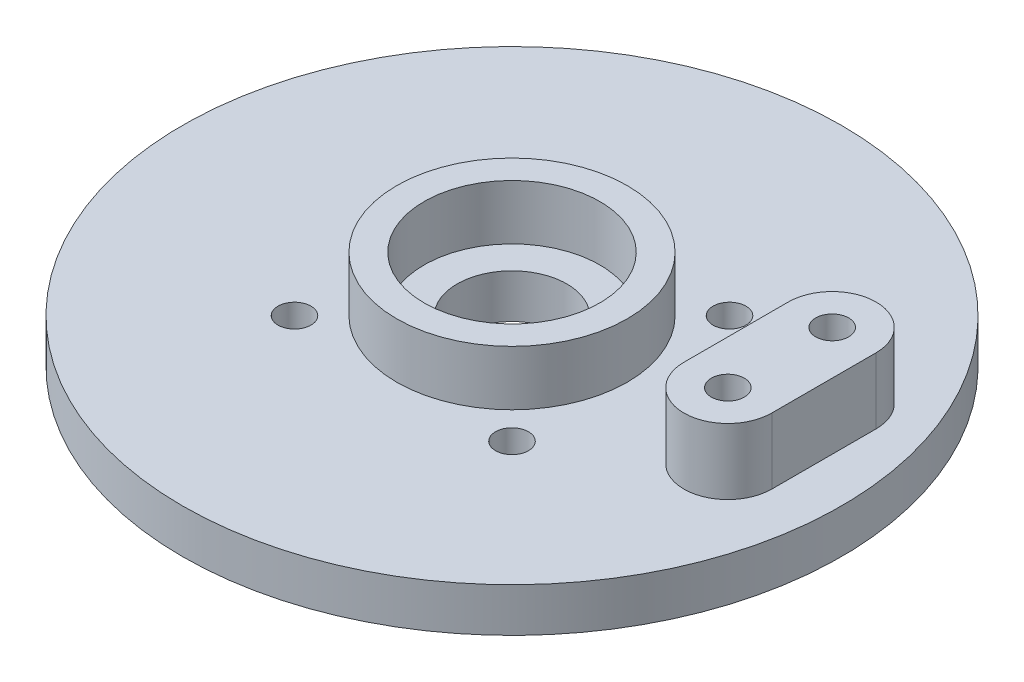
ISO-10303-21;
HEADER;
FILE_DESCRIPTION(('STEP AP214'),'2;1');
FILE_NAME('part.step','',(''),(''),'','','');
FILE_SCHEMA(('AUTOMOTIVE_DESIGN { 1 0 10303 214 1 1 1 1 }'));
ENDSEC;
DATA;
#1=APPLICATION_CONTEXT('core data for automotive mechanical design processes');
#2=APPLICATION_PROTOCOL_DEFINITION('international standard','automotive_design',2000,#1);
#3=PRODUCT_CONTEXT('',#1,'mechanical');
#4=PRODUCT('Part','Part','',(#3));
#5=PRODUCT_RELATED_PRODUCT_CATEGORY('part','',(#4));
#6=PRODUCT_DEFINITION_FORMATION('','',#4);
#7=PRODUCT_DEFINITION_CONTEXT('part definition',#1,'design');
#8=PRODUCT_DEFINITION('design','',#6,#7);
#9=PRODUCT_DEFINITION_SHAPE('','',#8);
#10=(LENGTH_UNIT() NAMED_UNIT(*) SI_UNIT(.MILLI.,.METRE.));
#11=(NAMED_UNIT(*) PLANE_ANGLE_UNIT() SI_UNIT($,.RADIAN.));
#12=(NAMED_UNIT(*) SI_UNIT($,.STERADIAN.) SOLID_ANGLE_UNIT());
#13=UNCERTAINTY_MEASURE_WITH_UNIT(LENGTH_MEASURE(1.E-05),#10,'distance_accuracy_value','');
#14=(GEOMETRIC_REPRESENTATION_CONTEXT(3) GLOBAL_UNCERTAINTY_ASSIGNED_CONTEXT((#13)) GLOBAL_UNIT_ASSIGNED_CONTEXT((#10,
#11,#12)) REPRESENTATION_CONTEXT('',''));
#15=CARTESIAN_POINT('',(0.,0.,0.));
#16=DIRECTION('',(0.,0.,1.));
#17=DIRECTION('',(1.,0.,0.));
#18=AXIS2_PLACEMENT_3D('',#15,#16,#17);
#19=CARTESIAN_POINT('',(0.,4.,0.));
#20=DIRECTION('',(0.,-1.,0.));
#21=DIRECTION('',(0.,0.,-1.));
#22=AXIS2_PLACEMENT_3D('',#19,#20,#21);
#23=CYLINDRICAL_SURFACE('',#22,30.);
#24=CARTESIAN_POINT('',(0.,4.,0.));
#25=DIRECTION('',(0.,1.,0.));
#26=DIRECTION('',(0.,0.,1.));
#27=AXIS2_PLACEMENT_3D('',#24,#25,#26);
#28=CIRCLE('',#27,30.);
#29=CARTESIAN_POINT('',(0.,4.,30.));
#30=VERTEX_POINT('',#29);
#31=EDGE_CURVE('E41',#30,#30,#28,.T.);
#32=ORIENTED_EDGE('',*,*,#31,.F.);
#33=EDGE_LOOP('',(#32));
#34=FACE_BOUND('',#33,.T.);
#35=CARTESIAN_POINT('',(0.,0.,0.));
#36=DIRECTION('',(0.,1.,0.));
#37=DIRECTION('',(0.,0.,1.));
#38=AXIS2_PLACEMENT_3D('',#35,#36,#37);
#39=CIRCLE('',#38,30.);
#40=CARTESIAN_POINT('',(0.,0.,30.));
#41=VERTEX_POINT('',#40);
#42=EDGE_CURVE('E149',#41,#41,#39,.T.);
#43=ORIENTED_EDGE('',*,*,#42,.T.);
#44=EDGE_LOOP('',(#43));
#45=FACE_BOUND('',#44,.T.);
#46=ADVANCED_FACE('F34',(#34,#45),#23,.T.);
#47=CARTESIAN_POINT('',(0.,4.,0.));
#48=DIRECTION('',(0.,1.,0.));
#49=DIRECTION('',(0.,0.,1.));
#50=AXIS2_PLACEMENT_3D('',#47,#48,#49);
#51=PLANE('',#50);
#52=DIRECTION('',(0.,0.,-1.));
#53=VECTOR('',#52,1.);
#54=CARTESIAN_POINT('',(25.5,4.,1.8534905745087));
#55=LINE('',#54,#53);
#56=CARTESIAN_POINT('',(25.5,4.,1.8534905745087));
#57=VERTEX_POINT('',#56);
#58=CARTESIAN_POINT('',(25.5,4.,-7.6465094254913));
#59=VERTEX_POINT('',#58);
#60=EDGE_CURVE('E90',#57,#59,#55,.T.);
#61=ORIENTED_EDGE('',*,*,#60,.F.);
#62=CARTESIAN_POINT('',(21.5,4.,1.8534905745087));
#63=DIRECTION('',(0.,1.,0.));
#64=DIRECTION('',(0.,0.,1.));
#65=AXIS2_PLACEMENT_3D('',#62,#63,#64);
#66=CIRCLE('',#65,3.99999999999999);
#67=CARTESIAN_POINT('',(17.5,4.,1.8534905745087));
#68=VERTEX_POINT('',#67);
#69=EDGE_CURVE('E101',#68,#57,#66,.T.);
#70=ORIENTED_EDGE('',*,*,#69,.F.);
#71=DIRECTION('',(0.,0.,1.));
#72=VECTOR('',#71,1.);
#73=CARTESIAN_POINT('',(17.5,4.,1.8534905745087));
#74=LINE('',#73,#72);
#75=CARTESIAN_POINT('',(17.5,4.,-7.6465094254913));
#76=VERTEX_POINT('',#75);
#77=EDGE_CURVE('E70',#76,#68,#74,.T.);
#78=ORIENTED_EDGE('',*,*,#77,.F.);
#79=CARTESIAN_POINT('',(21.5,4.,-7.6465094254913));
#80=DIRECTION('',(0.,1.,0.));
#81=DIRECTION('',(0.,0.,1.));
#82=AXIS2_PLACEMENT_3D('',#79,#80,#81);
#83=CIRCLE('',#82,3.99999999999999);
#84=EDGE_CURVE('E106',#59,#76,#83,.T.);
#85=ORIENTED_EDGE('',*,*,#84,.F.);
#86=EDGE_LOOP('',(#61,#70,#78,#85));
#87=FACE_BOUND('',#86,.T.);
#88=CARTESIAN_POINT('',(-9.9,4.,9.9));
#89=DIRECTION('',(0.,1.,0.));
#90=DIRECTION('',(0.,0.,1.));
#91=AXIS2_PLACEMENT_3D('',#88,#89,#90);
#92=CIRCLE('',#91,1.5);
#93=CARTESIAN_POINT('',(-9.9,4.,11.4));
#94=VERTEX_POINT('',#93);
#95=EDGE_CURVE('E112',#94,#94,#92,.T.);
#96=ORIENTED_EDGE('',*,*,#95,.F.);
#97=EDGE_LOOP('',(#96));
#98=FACE_BOUND('',#97,.T.);
#99=CARTESIAN_POINT('',(9.9,4.,9.9));
#100=DIRECTION('',(0.,1.,0.));
#101=DIRECTION('',(0.,0.,1.));
#102=AXIS2_PLACEMENT_3D('',#99,#100,#101);
#103=CIRCLE('',#102,1.5);
#104=CARTESIAN_POINT('',(9.9,4.,11.4));
#105=VERTEX_POINT('',#104);
#106=EDGE_CURVE('E129',#105,#105,#103,.T.);
#107=ORIENTED_EDGE('',*,*,#106,.F.);
#108=EDGE_LOOP('',(#107));
#109=FACE_BOUND('',#108,.T.);
#110=CARTESIAN_POINT('',(9.9,4.,-9.9));
#111=DIRECTION('',(0.,1.,0.));
#112=DIRECTION('',(0.,0.,1.));
#113=AXIS2_PLACEMENT_3D('',#110,#111,#112);
#114=CIRCLE('',#113,1.5);
#115=CARTESIAN_POINT('',(9.9,4.,-8.4));
#116=VERTEX_POINT('',#115);
#117=EDGE_CURVE('E123',#116,#116,#114,.T.);
#118=ORIENTED_EDGE('',*,*,#117,.F.);
#119=EDGE_LOOP('',(#118));
#120=FACE_BOUND('',#119,.T.);
#121=CARTESIAN_POINT('',(-9.9,4.,-9.9));
#122=DIRECTION('',(0.,1.,0.));
#123=DIRECTION('',(0.,0.,1.));
#124=AXIS2_PLACEMENT_3D('',#121,#122,#123);
#125=CIRCLE('',#124,1.5);
#126=CARTESIAN_POINT('',(-9.9,4.,-8.4));
#127=VERTEX_POINT('',#126);
#128=EDGE_CURVE('E117',#127,#127,#125,.T.);
#129=ORIENTED_EDGE('',*,*,#128,.F.);
#130=EDGE_LOOP('',(#129));
#131=FACE_BOUND('',#130,.T.);
#132=CARTESIAN_POINT('',(0.,4.,0.));
#133=DIRECTION('',(0.,1.,0.));
#134=DIRECTION('',(0.,0.,1.));
#135=AXIS2_PLACEMENT_3D('',#132,#133,#134);
#136=CIRCLE('',#135,10.5);
#137=CARTESIAN_POINT('',(0.,4.,10.5));
#138=VERTEX_POINT('',#137);
#139=EDGE_CURVE('E145',#138,#138,#136,.T.);
#140=ORIENTED_EDGE('',*,*,#139,.F.);
#141=EDGE_LOOP('',(#140));
#142=FACE_BOUND('',#141,.T.);
#143=ORIENTED_EDGE('',*,*,#31,.T.);
#144=EDGE_LOOP('',(#143));
#145=FACE_BOUND('',#144,.T.);
#146=ADVANCED_FACE('F160',(#87,#98,#109,#120,#131,#142,#145),#51,.T.);
#147=CARTESIAN_POINT('',(0.,0.,0.));
#148=DIRECTION('',(0.,1.,0.));
#149=DIRECTION('',(0.,0.,1.));
#150=AXIS2_PLACEMENT_3D('',#147,#148,#149);
#151=PLANE('',#150);
#152=CARTESIAN_POINT('',(21.5,0.,-7.6465094254913));
#153=DIRECTION('',(0.,1.,0.));
#154=DIRECTION('',(0.,0.,1.));
#155=AXIS2_PLACEMENT_3D('',#152,#153,#154);
#156=CIRCLE('',#155,1.5);
#157=CARTESIAN_POINT('',(21.5,0.,-6.1465094254913));
#158=VERTEX_POINT('',#157);
#159=EDGE_CURVE('E385',#158,#158,#156,.T.);
#160=ORIENTED_EDGE('',*,*,#159,.T.);
#161=EDGE_LOOP('',(#160));
#162=FACE_BOUND('',#161,.T.);
#163=CARTESIAN_POINT('',(21.5,0.,1.8534905745087));
#164=DIRECTION('',(0.,1.,0.));
#165=DIRECTION('',(0.,0.,1.));
#166=AXIS2_PLACEMENT_3D('',#163,#164,#165);
#167=CIRCLE('',#166,1.5);
#168=CARTESIAN_POINT('',(21.5,0.,3.3534905745087));
#169=VERTEX_POINT('',#168);
#170=EDGE_CURVE('E384',#169,#169,#167,.T.);
#171=ORIENTED_EDGE('',*,*,#170,.T.);
#172=EDGE_LOOP('',(#171));
#173=FACE_BOUND('',#172,.T.);
#174=CARTESIAN_POINT('',(-9.9,0.,9.9));
#175=DIRECTION('',(0.,1.,0.));
#176=DIRECTION('',(0.,0.,1.));
#177=AXIS2_PLACEMENT_3D('',#174,#175,#176);
#178=CIRCLE('',#177,1.5);
#179=CARTESIAN_POINT('',(-9.9,0.,11.4));
#180=VERTEX_POINT('',#179);
#181=EDGE_CURVE('E132',#180,#180,#178,.T.);
#182=ORIENTED_EDGE('',*,*,#181,.T.);
#183=EDGE_LOOP('',(#182));
#184=FACE_BOUND('',#183,.T.);
#185=CARTESIAN_POINT('',(9.9,0.,9.9));
#186=DIRECTION('',(0.,1.,0.));
#187=DIRECTION('',(0.,0.,1.));
#188=AXIS2_PLACEMENT_3D('',#185,#186,#187);
#189=CIRCLE('',#188,1.5);
#190=CARTESIAN_POINT('',(9.9,0.,11.4));
#191=VERTEX_POINT('',#190);
#192=EDGE_CURVE('E126',#191,#191,#189,.T.);
#193=ORIENTED_EDGE('',*,*,#192,.T.);
#194=EDGE_LOOP('',(#193));
#195=FACE_BOUND('',#194,.T.);
#196=CARTESIAN_POINT('',(9.9,0.,-9.9));
#197=DIRECTION('',(0.,1.,0.));
#198=DIRECTION('',(0.,0.,1.));
#199=AXIS2_PLACEMENT_3D('',#196,#197,#198);
#200=CIRCLE('',#199,1.5);
#201=CARTESIAN_POINT('',(9.9,0.,-8.4));
#202=VERTEX_POINT('',#201);
#203=EDGE_CURVE('E120',#202,#202,#200,.T.);
#204=ORIENTED_EDGE('',*,*,#203,.T.);
#205=EDGE_LOOP('',(#204));
#206=FACE_BOUND('',#205,.T.);
#207=CARTESIAN_POINT('',(-9.9,0.,-9.9));
#208=DIRECTION('',(0.,1.,0.));
#209=DIRECTION('',(0.,0.,1.));
#210=AXIS2_PLACEMENT_3D('',#207,#208,#209);
#211=CIRCLE('',#210,1.5);
#212=CARTESIAN_POINT('',(-9.9,0.,-8.4));
#213=VERTEX_POINT('',#212);
#214=EDGE_CURVE('E113',#213,#213,#211,.T.);
#215=ORIENTED_EDGE('',*,*,#214,.T.);
#216=EDGE_LOOP('',(#215));
#217=FACE_BOUND('',#216,.T.);
#218=CARTESIAN_POINT('',(0.,0.,0.));
#219=DIRECTION('',(0.,1.,0.));
#220=DIRECTION('',(0.,0.,1.));
#221=AXIS2_PLACEMENT_3D('',#218,#219,#220);
#222=CIRCLE('',#221,5.);
#223=CARTESIAN_POINT('',(0.,0.,5.));
#224=VERTEX_POINT('',#223);
#225=EDGE_CURVE('E137',#224,#224,#222,.T.);
#226=ORIENTED_EDGE('',*,*,#225,.T.);
#227=EDGE_LOOP('',(#226));
#228=FACE_BOUND('',#227,.T.);
#229=ORIENTED_EDGE('',*,*,#42,.F.);
#230=EDGE_LOOP('',(#229));
#231=FACE_BOUND('',#230,.T.);
#232=ADVANCED_FACE('F157',(#162,#173,#184,#195,#206,#217,#228,#231),#151,.F.);
#233=CARTESIAN_POINT('',(0.,9.,0.));
#234=DIRECTION('',(0.,1.,0.));
#235=DIRECTION('',(0.,0.,1.));
#236=AXIS2_PLACEMENT_3D('',#233,#234,#235);
#237=PLANE('',#236);
#238=CARTESIAN_POINT('',(0.,9.,0.));
#239=DIRECTION('',(0.,1.,0.));
#240=DIRECTION('',(0.,0.,1.));
#241=AXIS2_PLACEMENT_3D('',#238,#239,#240);
#242=CIRCLE('',#241,10.5);
#243=CARTESIAN_POINT('',(0.,9.,10.5));
#244=VERTEX_POINT('',#243);
#245=EDGE_CURVE('E146',#244,#244,#242,.T.);
#246=ORIENTED_EDGE('',*,*,#245,.T.);
#247=EDGE_LOOP('',(#246));
#248=FACE_BOUND('',#247,.T.);
#249=CARTESIAN_POINT('',(0.,9.,0.));
#250=DIRECTION('',(0.,1.,0.));
#251=DIRECTION('',(0.,0.,1.));
#252=AXIS2_PLACEMENT_3D('',#249,#250,#251);
#253=CIRCLE('',#252,8.);
#254=CARTESIAN_POINT('',(0.,9.,8.));
#255=VERTEX_POINT('',#254);
#256=EDGE_CURVE('E140',#255,#255,#253,.T.);
#257=ORIENTED_EDGE('',*,*,#256,.F.);
#258=EDGE_LOOP('',(#257));
#259=FACE_BOUND('',#258,.T.);
#260=ADVANCED_FACE('F159',(#248,#259),#237,.T.);
#261=CARTESIAN_POINT('',(0.,9.,0.));
#262=DIRECTION('',(0.,-1.,0.));
#263=DIRECTION('',(0.,0.,-1.));
#264=AXIS2_PLACEMENT_3D('',#261,#262,#263);
#265=CYLINDRICAL_SURFACE('',#264,10.5);
#266=ORIENTED_EDGE('',*,*,#245,.F.);
#267=EDGE_LOOP('',(#266));
#268=FACE_BOUND('',#267,.T.);
#269=ORIENTED_EDGE('',*,*,#139,.T.);
#270=EDGE_LOOP('',(#269));
#271=FACE_BOUND('',#270,.T.);
#272=ADVANCED_FACE('F166',(#268,#271),#265,.T.);
#273=CARTESIAN_POINT('',(0.,9.,0.));
#274=DIRECTION('',(0.,-1.,0.));
#275=DIRECTION('',(0.,0.,-1.));
#276=AXIS2_PLACEMENT_3D('',#273,#274,#275);
#277=CYLINDRICAL_SURFACE('',#276,8.);
#278=ORIENTED_EDGE('',*,*,#256,.T.);
#279=EDGE_LOOP('',(#278));
#280=FACE_BOUND('',#279,.T.);
#281=CARTESIAN_POINT('',(0.,4.,0.));
#282=DIRECTION('',(0.,1.,0.));
#283=DIRECTION('',(0.,0.,1.));
#284=AXIS2_PLACEMENT_3D('',#281,#282,#283);
#285=CIRCLE('',#284,8.);
#286=CARTESIAN_POINT('',(0.,4.,8.));
#287=VERTEX_POINT('',#286);
#288=EDGE_CURVE('E11',#287,#287,#285,.F.);
#289=ORIENTED_EDGE('',*,*,#288,.T.);
#290=EDGE_LOOP('',(#289));
#291=FACE_BOUND('',#290,.T.);
#292=ADVANCED_FACE('F291',(#280,#291),#277,.F.);
#293=CARTESIAN_POINT('',(0.,4.,0.));
#294=DIRECTION('',(0.,1.,0.));
#295=DIRECTION('',(0.,0.,1.));
#296=AXIS2_PLACEMENT_3D('',#293,#294,#295);
#297=CIRCLE('',#296,5.);
#298=CARTESIAN_POINT('',(0.,4.,5.));
#299=VERTEX_POINT('',#298);
#300=EDGE_CURVE('E116',#299,#299,#297,.T.);
#301=ORIENTED_EDGE('',*,*,#300,.F.);
#302=EDGE_LOOP('',(#301));
#303=FACE_BOUND('',#302,.T.);
#304=ORIENTED_EDGE('',*,*,#288,.F.);
#305=EDGE_LOOP('',(#304));
#306=FACE_BOUND('',#305,.T.);
#307=ADVANCED_FACE('F171',(#303,#306),#51,.T.);
#308=CARTESIAN_POINT('',(0.,0.,0.));
#309=DIRECTION('',(0.,1.,0.));
#310=DIRECTION('',(0.,0.,1.));
#311=AXIS2_PLACEMENT_3D('',#308,#309,#310);
#312=CYLINDRICAL_SURFACE('',#311,5.);
#313=ORIENTED_EDGE('',*,*,#225,.F.);
#314=EDGE_LOOP('',(#313));
#315=FACE_BOUND('',#314,.T.);
#316=ORIENTED_EDGE('',*,*,#300,.T.);
#317=EDGE_LOOP('',(#316));
#318=FACE_BOUND('',#317,.T.);
#319=ADVANCED_FACE('F277',(#315,#318),#312,.F.);
#320=CARTESIAN_POINT('',(-9.9,0.,-9.9));
#321=DIRECTION('',(0.,1.,0.));
#322=DIRECTION('',(0.,0.,1.));
#323=AXIS2_PLACEMENT_3D('',#320,#321,#322);
#324=CYLINDRICAL_SURFACE('',#323,1.5);
#325=ORIENTED_EDGE('',*,*,#214,.F.);
#326=EDGE_LOOP('',(#325));
#327=FACE_BOUND('',#326,.T.);
#328=ORIENTED_EDGE('',*,*,#128,.T.);
#329=EDGE_LOOP('',(#328));
#330=FACE_BOUND('',#329,.T.);
#331=ADVANCED_FACE('F273',(#327,#330),#324,.F.);
#332=CARTESIAN_POINT('',(9.9,0.,-9.9));
#333=DIRECTION('',(0.,1.,0.));
#334=DIRECTION('',(0.,0.,1.));
#335=AXIS2_PLACEMENT_3D('',#332,#333,#334);
#336=CYLINDRICAL_SURFACE('',#335,1.5);
#337=ORIENTED_EDGE('',*,*,#203,.F.);
#338=EDGE_LOOP('',(#337));
#339=FACE_BOUND('',#338,.T.);
#340=ORIENTED_EDGE('',*,*,#117,.T.);
#341=EDGE_LOOP('',(#340));
#342=FACE_BOUND('',#341,.T.);
#343=ADVANCED_FACE('F276',(#339,#342),#336,.F.);
#344=CARTESIAN_POINT('',(9.9,0.,9.9));
#345=DIRECTION('',(0.,1.,0.));
#346=DIRECTION('',(0.,0.,1.));
#347=AXIS2_PLACEMENT_3D('',#344,#345,#346);
#348=CYLINDRICAL_SURFACE('',#347,1.5);
#349=ORIENTED_EDGE('',*,*,#192,.F.);
#350=EDGE_LOOP('',(#349));
#351=FACE_BOUND('',#350,.T.);
#352=ORIENTED_EDGE('',*,*,#106,.T.);
#353=EDGE_LOOP('',(#352));
#354=FACE_BOUND('',#353,.T.);
#355=ADVANCED_FACE('F281',(#351,#354),#348,.F.);
#356=CARTESIAN_POINT('',(-9.9,0.,9.9));
#357=DIRECTION('',(0.,1.,0.));
#358=DIRECTION('',(0.,0.,1.));
#359=AXIS2_PLACEMENT_3D('',#356,#357,#358);
#360=CYLINDRICAL_SURFACE('',#359,1.5);
#361=ORIENTED_EDGE('',*,*,#181,.F.);
#362=EDGE_LOOP('',(#361));
#363=FACE_BOUND('',#362,.T.);
#364=ORIENTED_EDGE('',*,*,#95,.T.);
#365=EDGE_LOOP('',(#364));
#366=FACE_BOUND('',#365,.T.);
#367=ADVANCED_FACE('F192',(#363,#366),#360,.F.);
#368=CARTESIAN_POINT('',(21.5,10.,1.8534905745087));
#369=DIRECTION('',(0.,1.,0.));
#370=DIRECTION('',(0.,0.,1.));
#371=AXIS2_PLACEMENT_3D('',#368,#369,#370);
#372=PLANE('',#371);
#373=CARTESIAN_POINT('',(21.5,10.,-7.6465094254913));
#374=DIRECTION('',(0.,1.,0.));
#375=DIRECTION('',(0.,0.,1.));
#376=AXIS2_PLACEMENT_3D('',#373,#374,#375);
#377=CIRCLE('',#376,1.5);
#378=CARTESIAN_POINT('',(21.5,10.,-6.1465094254913));
#379=VERTEX_POINT('',#378);
#380=EDGE_CURVE('E104',#379,#379,#377,.T.);
#381=ORIENTED_EDGE('',*,*,#380,.F.);
#382=EDGE_LOOP('',(#381));
#383=FACE_BOUND('',#382,.T.);
#384=CARTESIAN_POINT('',(21.5,10.,1.8534905745087));
#385=DIRECTION('',(0.,1.,0.));
#386=DIRECTION('',(0.,0.,1.));
#387=AXIS2_PLACEMENT_3D('',#384,#385,#386);
#388=CIRCLE('',#387,3.99999999999999);
#389=CARTESIAN_POINT('',(17.5,10.,1.8534905745087));
#390=VERTEX_POINT('',#389);
#391=CARTESIAN_POINT('',(25.5,10.,1.8534905745087));
#392=VERTEX_POINT('',#391);
#393=EDGE_CURVE('E83',#390,#392,#388,.T.);
#394=ORIENTED_EDGE('',*,*,#393,.T.);
#395=DIRECTION('',(0.,0.,-1.));
#396=VECTOR('',#395,1.);
#397=CARTESIAN_POINT('',(25.5,10.,1.8534905745087));
#398=LINE('',#397,#396);
#399=CARTESIAN_POINT('',(25.5,10.,-7.6465094254913));
#400=VERTEX_POINT('',#399);
#401=EDGE_CURVE('E77',#392,#400,#398,.T.);
#402=ORIENTED_EDGE('',*,*,#401,.T.);
#403=CARTESIAN_POINT('',(21.5,10.,-7.6465094254913));
#404=DIRECTION('',(0.,1.,0.));
#405=DIRECTION('',(0.,0.,1.));
#406=AXIS2_PLACEMENT_3D('',#403,#404,#405);
#407=CIRCLE('',#406,3.99999999999999);
#408=CARTESIAN_POINT('',(17.5,10.,-7.6465094254913));
#409=VERTEX_POINT('',#408);
#410=EDGE_CURVE('E81',#400,#409,#407,.T.);
#411=ORIENTED_EDGE('',*,*,#410,.T.);
#412=DIRECTION('',(0.,0.,1.));
#413=VECTOR('',#412,1.);
#414=CARTESIAN_POINT('',(17.5,10.,1.8534905745087));
#415=LINE('',#414,#413);
#416=EDGE_CURVE('E56',#409,#390,#415,.T.);
#417=ORIENTED_EDGE('',*,*,#416,.T.);
#418=EDGE_LOOP('',(#394,#402,#411,#417));
#419=FACE_BOUND('',#418,.T.);
#420=CARTESIAN_POINT('',(21.5,10.,1.8534905745087));
#421=DIRECTION('',(0.,1.,0.));
#422=DIRECTION('',(0.,0.,1.));
#423=AXIS2_PLACEMENT_3D('',#420,#421,#422);
#424=CIRCLE('',#423,1.5);
#425=CARTESIAN_POINT('',(21.5,10.,3.3534905745087));
#426=VERTEX_POINT('',#425);
#427=EDGE_CURVE('E381',#426,#426,#424,.T.);
#428=ORIENTED_EDGE('',*,*,#427,.F.);
#429=EDGE_LOOP('',(#428));
#430=FACE_BOUND('',#429,.T.);
#431=ADVANCED_FACE('F78',(#383,#419,#430),#372,.T.);
#432=CARTESIAN_POINT('',(21.5,10.,1.8534905745087));
#433=DIRECTION('',(0.,-1.,0.));
#434=DIRECTION('',(0.,0.,-1.));
#435=AXIS2_PLACEMENT_3D('',#432,#433,#434);
#436=CYLINDRICAL_SURFACE('',#435,3.99999999999999);
#437=ORIENTED_EDGE('',*,*,#69,.T.);
#438=DIRECTION('',(0.,-1.,0.));
#439=VECTOR('',#438,1.);
#440=CARTESIAN_POINT('',(25.5,10.,1.8534905745087));
#441=LINE('',#440,#439);
#442=EDGE_CURVE('E93',#392,#57,#441,.T.);
#443=ORIENTED_EDGE('',*,*,#442,.F.);
#444=ORIENTED_EDGE('',*,*,#393,.F.);
#445=DIRECTION('',(0.,-1.,0.));
#446=VECTOR('',#445,1.);
#447=CARTESIAN_POINT('',(17.5,10.,1.8534905745087));
#448=LINE('',#447,#446);
#449=EDGE_CURVE('E97',#390,#68,#448,.T.);
#450=ORIENTED_EDGE('',*,*,#449,.T.);
#451=EDGE_LOOP('',(#437,#443,#444,#450));
#452=FACE_BOUND('',#451,.T.);
#453=ADVANCED_FACE('F201',(#452),#436,.T.);
#454=CARTESIAN_POINT('',(25.5,10.,1.8534905745087));
#455=DIRECTION('',(-1.,0.,0.));
#456=DIRECTION('',(0.,0.,1.));
#457=AXIS2_PLACEMENT_3D('',#454,#455,#456);
#458=PLANE('',#457);
#459=ORIENTED_EDGE('',*,*,#60,.T.);
#460=DIRECTION('',(0.,-1.,0.));
#461=VECTOR('',#460,1.);
#462=CARTESIAN_POINT('',(25.5,10.,-7.6465094254913));
#463=LINE('',#462,#461);
#464=EDGE_CURVE('E87',#400,#59,#463,.T.);
#465=ORIENTED_EDGE('',*,*,#464,.F.);
#466=ORIENTED_EDGE('',*,*,#401,.F.);
#467=ORIENTED_EDGE('',*,*,#442,.T.);
#468=EDGE_LOOP('',(#459,#465,#466,#467));
#469=FACE_BOUND('',#468,.T.);
#470=ADVANCED_FACE('F88',(#469),#458,.F.);
#471=CARTESIAN_POINT('',(21.5,10.,-7.6465094254913));
#472=DIRECTION('',(0.,-1.,0.));
#473=DIRECTION('',(0.,0.,-1.));
#474=AXIS2_PLACEMENT_3D('',#471,#472,#473);
#475=CYLINDRICAL_SURFACE('',#474,3.99999999999999);
#476=ORIENTED_EDGE('',*,*,#84,.T.);
#477=DIRECTION('',(0.,-1.,0.));
#478=VECTOR('',#477,1.);
#479=CARTESIAN_POINT('',(17.5,10.,-7.6465094254913));
#480=LINE('',#479,#478);
#481=EDGE_CURVE('E48',#409,#76,#480,.T.);
#482=ORIENTED_EDGE('',*,*,#481,.F.);
#483=ORIENTED_EDGE('',*,*,#410,.F.);
#484=ORIENTED_EDGE('',*,*,#464,.T.);
#485=EDGE_LOOP('',(#476,#482,#483,#484));
#486=FACE_BOUND('',#485,.T.);
#487=ADVANCED_FACE('F95',(#486),#475,.T.);
#488=CARTESIAN_POINT('',(17.5,10.,1.8534905745087));
#489=DIRECTION('',(1.,0.,0.));
#490=DIRECTION('',(0.,0.,-1.));
#491=AXIS2_PLACEMENT_3D('',#488,#489,#490);
#492=PLANE('',#491);
#493=ORIENTED_EDGE('',*,*,#77,.T.);
#494=ORIENTED_EDGE('',*,*,#449,.F.);
#495=ORIENTED_EDGE('',*,*,#416,.F.);
#496=ORIENTED_EDGE('',*,*,#481,.T.);
#497=EDGE_LOOP('',(#493,#494,#495,#496));
#498=FACE_BOUND('',#497,.T.);
#499=ADVANCED_FACE('F228',(#498),#492,.F.);
#500=CARTESIAN_POINT('',(21.5,10.,-7.6465094254913));
#501=DIRECTION('',(0.,-1.,0.));
#502=DIRECTION('',(0.,0.,-1.));
#503=AXIS2_PLACEMENT_3D('',#500,#501,#502);
#504=CYLINDRICAL_SURFACE('',#503,1.5);
#505=ORIENTED_EDGE('',*,*,#380,.T.);
#506=EDGE_LOOP('',(#505));
#507=FACE_BOUND('',#506,.T.);
#508=ORIENTED_EDGE('',*,*,#159,.F.);
#509=EDGE_LOOP('',(#508));
#510=FACE_BOUND('',#509,.T.);
#511=ADVANCED_FACE('F236',(#507,#510),#504,.F.);
#512=CARTESIAN_POINT('',(21.5,10.,1.8534905745087));
#513=DIRECTION('',(0.,-1.,0.));
#514=DIRECTION('',(0.,0.,-1.));
#515=AXIS2_PLACEMENT_3D('',#512,#513,#514);
#516=CYLINDRICAL_SURFACE('',#515,1.5);
#517=ORIENTED_EDGE('',*,*,#427,.T.);
#518=EDGE_LOOP('',(#517));
#519=FACE_BOUND('',#518,.T.);
#520=ORIENTED_EDGE('',*,*,#170,.F.);
#521=EDGE_LOOP('',(#520));
#522=FACE_BOUND('',#521,.T.);
#523=ADVANCED_FACE('F251',(#519,#522),#516,.F.);
#524=CLOSED_SHELL('',(#46,#146,#232,#260,#272,#292,#307,#319,#331,#343,#355,#367,#431,#453,#470,
#487,#499,#511,#523));
#525=MANIFOLD_SOLID_BREP('B2',#524);
#526=ADVANCED_BREP_SHAPE_REPRESENTATION('',(#18,#525),#14);
#527=SHAPE_DEFINITION_REPRESENTATION(#9,#526);
ENDSEC;
END-ISO-10303-21;
